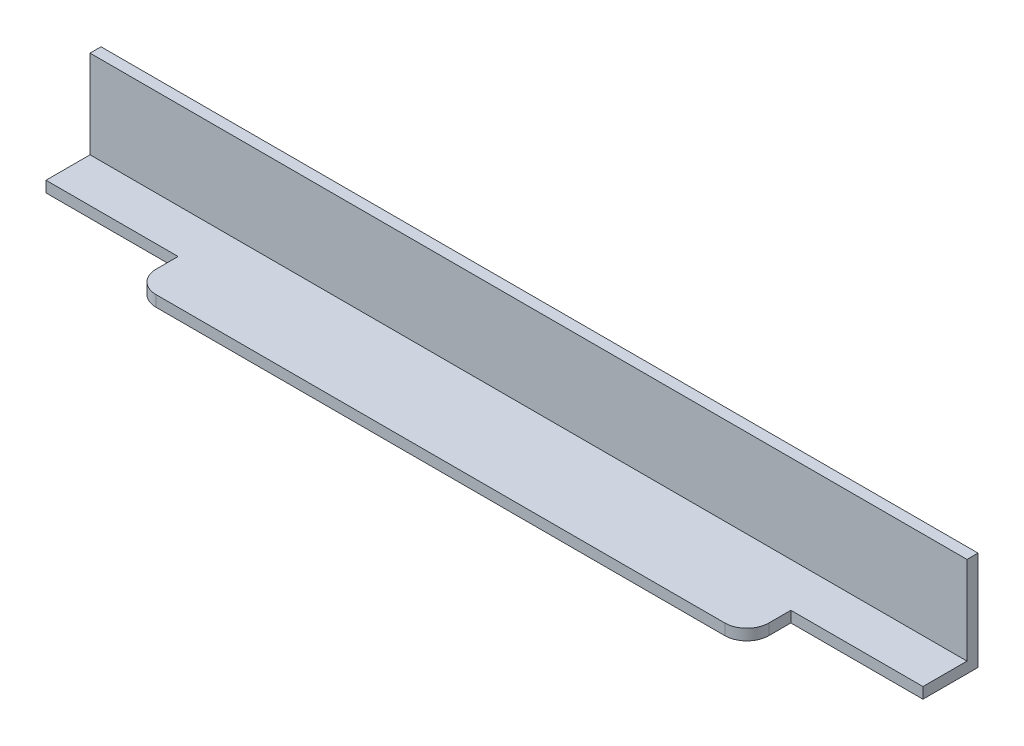
ISO-10303-21;
HEADER;
FILE_DESCRIPTION(('STEP AP214'),'2;1');
FILE_NAME('part.step','',(''),(''),'','','');
FILE_SCHEMA(('AUTOMOTIVE_DESIGN { 1 0 10303 214 1 1 1 1 }'));
ENDSEC;
DATA;
#1=APPLICATION_CONTEXT('core data for automotive mechanical design processes');
#2=APPLICATION_PROTOCOL_DEFINITION('international standard','automotive_design',2000,#1);
#3=PRODUCT_CONTEXT('',#1,'mechanical');
#4=PRODUCT('Part','Part','',(#3));
#5=PRODUCT_RELATED_PRODUCT_CATEGORY('part','',(#4));
#6=PRODUCT_DEFINITION_FORMATION('','',#4);
#7=PRODUCT_DEFINITION_CONTEXT('part definition',#1,'design');
#8=PRODUCT_DEFINITION('design','',#6,#7);
#9=PRODUCT_DEFINITION_SHAPE('','',#8);
#10=(LENGTH_UNIT() NAMED_UNIT(*) SI_UNIT(.MILLI.,.METRE.));
#11=(NAMED_UNIT(*) PLANE_ANGLE_UNIT() SI_UNIT($,.RADIAN.));
#12=(NAMED_UNIT(*) SI_UNIT($,.STERADIAN.) SOLID_ANGLE_UNIT());
#13=UNCERTAINTY_MEASURE_WITH_UNIT(LENGTH_MEASURE(1.E-05),#10,'distance_accuracy_value','');
#14=(GEOMETRIC_REPRESENTATION_CONTEXT(3) GLOBAL_UNCERTAINTY_ASSIGNED_CONTEXT((#13)) GLOBAL_UNIT_ASSIGNED_CONTEXT((#10,
#11,#12)) REPRESENTATION_CONTEXT('',''));
#15=CARTESIAN_POINT('',(0.,0.,0.));
#16=DIRECTION('',(0.,0.,1.));
#17=DIRECTION('',(1.,0.,0.));
#18=AXIS2_PLACEMENT_3D('',#15,#16,#17);
#19=CARTESIAN_POINT('',(0.,0.,15.));
#20=DIRECTION('',(0.,0.,-1.));
#21=DIRECTION('',(-1.,0.,0.));
#22=AXIS2_PLACEMENT_3D('',#19,#20,#21);
#23=PLANE('',#22);
#24=DIRECTION('',(0.,1.,0.));
#25=VECTOR('',#24,1.);
#26=CARTESIAN_POINT('',(-36.,-27.,15.));
#27=LINE('',#26,#25);
#28=CARTESIAN_POINT('',(-36.,-27.,15.));
#29=VERTEX_POINT('',#28);
#30=CARTESIAN_POINT('',(-36.,-24.,15.));
#31=VERTEX_POINT('',#30);
#32=EDGE_CURVE('E170',#29,#31,#27,.T.);
#33=ORIENTED_EDGE('',*,*,#32,.F.);
#34=DIRECTION('',(1.,0.,0.));
#35=VECTOR('',#34,1.);
#36=CARTESIAN_POINT('',(-239.,-27.,15.));
#37=LINE('',#36,#35);
#38=CARTESIAN_POINT('',(0.,-27.,15.));
#39=VERTEX_POINT('',#38);
#40=EDGE_CURVE('E180',#29,#39,#37,.T.);
#41=ORIENTED_EDGE('',*,*,#40,.T.);
#42=DIRECTION('',(0.,1.,0.));
#43=VECTOR('',#42,1.);
#44=CARTESIAN_POINT('',(0.,-27.,15.));
#45=LINE('',#44,#43);
#46=CARTESIAN_POINT('',(0.,-24.,15.));
#47=VERTEX_POINT('',#46);
#48=EDGE_CURVE('E183',#39,#47,#45,.T.);
#49=ORIENTED_EDGE('',*,*,#48,.T.);
#50=DIRECTION('',(-1.,0.,0.));
#51=VECTOR('',#50,1.);
#52=CARTESIAN_POINT('',(-239.,-24.,15.));
#53=LINE('',#52,#51);
#54=EDGE_CURVE('E186',#47,#31,#53,.T.);
#55=ORIENTED_EDGE('',*,*,#54,.T.);
#56=EDGE_LOOP('',(#33,#41,#49,#55));
#57=FACE_BOUND('',#56,.T.);
#58=ADVANCED_FACE('F39',(#57),#23,.F.);
#59=CARTESIAN_POINT('',(0.,0.,3.));
#60=DIRECTION('',(0.,0.,-1.));
#61=DIRECTION('',(-1.,0.,0.));
#62=AXIS2_PLACEMENT_3D('',#59,#60,#61);
#63=PLANE('',#62);
#64=DIRECTION('',(-1.,0.,0.));
#65=VECTOR('',#64,1.);
#66=CARTESIAN_POINT('',(-239.,-24.,3.));
#67=LINE('',#66,#65);
#68=CARTESIAN_POINT('',(0.,-24.,3.));
#69=VERTEX_POINT('',#68);
#70=CARTESIAN_POINT('',(-239.,-24.,3.));
#71=VERTEX_POINT('',#70);
#72=EDGE_CURVE('E62',#69,#71,#67,.T.);
#73=ORIENTED_EDGE('',*,*,#72,.F.);
#74=DIRECTION('',(0.,1.,0.));
#75=VECTOR('',#74,1.);
#76=CARTESIAN_POINT('',(0.,0.,3.));
#77=LINE('',#76,#75);
#78=CARTESIAN_POINT('',(0.,0.,3.));
#79=VERTEX_POINT('',#78);
#80=EDGE_CURVE('E197',#69,#79,#77,.T.);
#81=ORIENTED_EDGE('',*,*,#80,.T.);
#82=DIRECTION('',(-1.,0.,0.));
#83=VECTOR('',#82,1.);
#84=CARTESIAN_POINT('',(0.,0.,3.));
#85=LINE('',#84,#83);
#86=CARTESIAN_POINT('',(-239.,0.,3.));
#87=VERTEX_POINT('',#86);
#88=EDGE_CURVE('E199',#79,#87,#85,.T.);
#89=ORIENTED_EDGE('',*,*,#88,.T.);
#90=DIRECTION('',(0.,-1.,0.));
#91=VECTOR('',#90,1.);
#92=CARTESIAN_POINT('',(-239.,0.,3.));
#93=LINE('',#92,#91);
#94=EDGE_CURVE('E202',#87,#71,#93,.T.);
#95=ORIENTED_EDGE('',*,*,#94,.T.);
#96=EDGE_LOOP('',(#73,#81,#89,#95));
#97=FACE_BOUND('',#96,.T.);
#98=ADVANCED_FACE('F263',(#97),#63,.F.);
#99=CARTESIAN_POINT('',(0.,0.,3.));
#100=DIRECTION('',(-1.,0.,0.));
#101=DIRECTION('',(0.,-1.,0.));
#102=AXIS2_PLACEMENT_3D('',#99,#100,#101);
#103=PLANE('',#102);
#104=DIRECTION('',(0.,1.,0.));
#105=VECTOR('',#104,1.);
#106=CARTESIAN_POINT('',(0.,0.,0.));
#107=LINE('',#106,#105);
#108=CARTESIAN_POINT('',(0.,-27.,0.));
#109=VERTEX_POINT('',#108);
#110=CARTESIAN_POINT('',(0.,0.,0.));
#111=VERTEX_POINT('',#110);
#112=EDGE_CURVE('E196',#109,#111,#107,.T.);
#113=ORIENTED_EDGE('',*,*,#112,.T.);
#114=DIRECTION('',(0.,0.,-1.));
#115=VECTOR('',#114,1.);
#116=CARTESIAN_POINT('',(0.,0.,3.));
#117=LINE('',#116,#115);
#118=EDGE_CURVE('E11',#79,#111,#117,.T.);
#119=ORIENTED_EDGE('',*,*,#118,.F.);
#120=ORIENTED_EDGE('',*,*,#80,.F.);
#121=DIRECTION('',(0.,0.,-1.));
#122=VECTOR('',#121,1.);
#123=CARTESIAN_POINT('',(0.,-24.,15.));
#124=LINE('',#123,#122);
#125=EDGE_CURVE('E193',#47,#69,#124,.T.);
#126=ORIENTED_EDGE('',*,*,#125,.F.);
#127=ORIENTED_EDGE('',*,*,#48,.F.);
#128=DIRECTION('',(0.,0.,-1.));
#129=VECTOR('',#128,1.);
#130=CARTESIAN_POINT('',(0.,-27.,3.));
#131=LINE('',#130,#129);
#132=EDGE_CURVE('E204',#39,#109,#131,.T.);
#133=ORIENTED_EDGE('',*,*,#132,.T.);
#134=EDGE_LOOP('',(#113,#119,#120,#126,#127,#133));
#135=FACE_BOUND('',#134,.T.);
#136=ADVANCED_FACE('F41',(#135),#103,.F.);
#137=CARTESIAN_POINT('',(0.,0.,3.));
#138=DIRECTION('',(0.,-1.,0.));
#139=DIRECTION('',(0.,0.,-1.));
#140=AXIS2_PLACEMENT_3D('',#137,#138,#139);
#141=PLANE('',#140);
#142=DIRECTION('',(-1.,0.,0.));
#143=VECTOR('',#142,1.);
#144=CARTESIAN_POINT('',(0.,0.,0.));
#145=LINE('',#144,#143);
#146=CARTESIAN_POINT('',(-239.,0.,0.));
#147=VERTEX_POINT('',#146);
#148=EDGE_CURVE('E207',#111,#147,#145,.T.);
#149=ORIENTED_EDGE('',*,*,#148,.T.);
#150=DIRECTION('',(0.,0.,-1.));
#151=VECTOR('',#150,1.);
#152=CARTESIAN_POINT('',(-239.,0.,3.));
#153=LINE('',#152,#151);
#154=EDGE_CURVE('E47',#87,#147,#153,.T.);
#155=ORIENTED_EDGE('',*,*,#154,.F.);
#156=ORIENTED_EDGE('',*,*,#88,.F.);
#157=ORIENTED_EDGE('',*,*,#118,.T.);
#158=EDGE_LOOP('',(#149,#155,#156,#157));
#159=FACE_BOUND('',#158,.T.);
#160=ADVANCED_FACE('F271',(#159),#141,.F.);
#161=CARTESIAN_POINT('',(-239.,0.,3.));
#162=DIRECTION('',(1.,0.,0.));
#163=DIRECTION('',(0.,0.,-1.));
#164=AXIS2_PLACEMENT_3D('',#161,#162,#163);
#165=PLANE('',#164);
#166=DIRECTION('',(0.,-1.,0.));
#167=VECTOR('',#166,1.);
#168=CARTESIAN_POINT('',(-239.,0.,0.));
#169=LINE('',#168,#167);
#170=CARTESIAN_POINT('',(-239.,-27.,0.));
#171=VERTEX_POINT('',#170);
#172=EDGE_CURVE('E209',#147,#171,#169,.T.);
#173=ORIENTED_EDGE('',*,*,#172,.T.);
#174=DIRECTION('',(0.,0.,-1.));
#175=VECTOR('',#174,1.);
#176=CARTESIAN_POINT('',(-239.,-27.,3.));
#177=LINE('',#176,#175);
#178=CARTESIAN_POINT('',(-239.,-27.,15.));
#179=VERTEX_POINT('',#178);
#180=EDGE_CURVE('E214',#179,#171,#177,.T.);
#181=ORIENTED_EDGE('',*,*,#180,.F.);
#182=DIRECTION('',(0.,-1.,0.));
#183=VECTOR('',#182,1.);
#184=CARTESIAN_POINT('',(-239.,-27.,15.));
#185=LINE('',#184,#183);
#186=CARTESIAN_POINT('',(-239.,-24.,15.));
#187=VERTEX_POINT('',#186);
#188=EDGE_CURVE('E177',#187,#179,#185,.T.);
#189=ORIENTED_EDGE('',*,*,#188,.F.);
#190=DIRECTION('',(0.,0.,-1.));
#191=VECTOR('',#190,1.);
#192=CARTESIAN_POINT('',(-239.,-24.,15.));
#193=LINE('',#192,#191);
#194=EDGE_CURVE('E189',#187,#71,#193,.T.);
#195=ORIENTED_EDGE('',*,*,#194,.T.);
#196=ORIENTED_EDGE('',*,*,#94,.F.);
#197=ORIENTED_EDGE('',*,*,#154,.T.);
#198=EDGE_LOOP('',(#173,#181,#189,#195,#196,#197));
#199=FACE_BOUND('',#198,.T.);
#200=ADVANCED_FACE('F221',(#199),#165,.F.);
#201=CARTESIAN_POINT('',(0.,-27.,3.));
#202=DIRECTION('',(0.,1.,0.));
#203=DIRECTION('',(-1.,0.,0.));
#204=AXIS2_PLACEMENT_3D('',#201,#202,#203);
#205=PLANE('',#204);
#206=DIRECTION('',(1.,0.,0.));
#207=VECTOR('',#206,1.);
#208=CARTESIAN_POINT('',(0.,-27.,0.));
#209=LINE('',#208,#207);
#210=EDGE_CURVE('E200',#171,#109,#209,.T.);
#211=ORIENTED_EDGE('',*,*,#210,.T.);
#212=ORIENTED_EDGE('',*,*,#132,.F.);
#213=ORIENTED_EDGE('',*,*,#40,.F.);
#214=DIRECTION('',(0.,0.,-1.));
#215=VECTOR('',#214,1.);
#216=CARTESIAN_POINT('',(-36.,-27.,15.));
#217=LINE('',#216,#215);
#218=CARTESIAN_POINT('',(-36.,-27.,21.));
#219=VERTEX_POINT('',#218);
#220=EDGE_CURVE('E136',#219,#29,#217,.T.);
#221=ORIENTED_EDGE('',*,*,#220,.F.);
#222=CARTESIAN_POINT('',(-42.,-27.,21.));
#223=DIRECTION('',(0.,1.,0.));
#224=DIRECTION('',(0.,0.,1.));
#225=AXIS2_PLACEMENT_3D('',#222,#223,#224);
#226=CIRCLE('',#225,6.);
#227=CARTESIAN_POINT('',(-42.,-27.,27.));
#228=VERTEX_POINT('',#227);
#229=EDGE_CURVE('E158',#228,#219,#226,.T.);
#230=ORIENTED_EDGE('',*,*,#229,.F.);
#231=DIRECTION('',(1.,0.,0.));
#232=VECTOR('',#231,1.);
#233=CARTESIAN_POINT('',(-197.,-27.,27.));
#234=LINE('',#233,#232);
#235=CARTESIAN_POINT('',(-197.,-27.,27.));
#236=VERTEX_POINT('',#235);
#237=EDGE_CURVE('E147',#236,#228,#234,.T.);
#238=ORIENTED_EDGE('',*,*,#237,.F.);
#239=CARTESIAN_POINT('',(-197.,-27.,21.));
#240=DIRECTION('',(0.,1.,0.));
#241=DIRECTION('',(0.,0.,1.));
#242=AXIS2_PLACEMENT_3D('',#239,#240,#241);
#243=CIRCLE('',#242,6.);
#244=CARTESIAN_POINT('',(-203.,-27.,21.));
#245=VERTEX_POINT('',#244);
#246=EDGE_CURVE('E131',#245,#236,#243,.T.);
#247=ORIENTED_EDGE('',*,*,#246,.F.);
#248=DIRECTION('',(0.,0.,1.));
#249=VECTOR('',#248,1.);
#250=CARTESIAN_POINT('',(-203.,-27.,15.));
#251=LINE('',#250,#249);
#252=CARTESIAN_POINT('',(-203.,-27.,15.));
#253=VERTEX_POINT('',#252);
#254=EDGE_CURVE('E143',#253,#245,#251,.T.);
#255=ORIENTED_EDGE('',*,*,#254,.F.);
#256=EDGE_CURVE('E181',#179,#253,#37,.T.);
#257=ORIENTED_EDGE('',*,*,#256,.F.);
#258=ORIENTED_EDGE('',*,*,#180,.T.);
#259=EDGE_LOOP('',(#211,#212,#213,#221,#230,#238,#247,#255,#257,#258));
#260=FACE_BOUND('',#259,.T.);
#261=ADVANCED_FACE('F141',(#260),#205,.F.);
#262=CARTESIAN_POINT('',(0.,0.,0.));
#263=DIRECTION('',(0.,0.,-1.));
#264=DIRECTION('',(-1.,0.,0.));
#265=AXIS2_PLACEMENT_3D('',#262,#263,#264);
#266=PLANE('',#265);
#267=ORIENTED_EDGE('',*,*,#112,.F.);
#268=ORIENTED_EDGE('',*,*,#210,.F.);
#269=ORIENTED_EDGE('',*,*,#172,.F.);
#270=ORIENTED_EDGE('',*,*,#148,.F.);
#271=EDGE_LOOP('',(#267,#268,#269,#270));
#272=FACE_BOUND('',#271,.T.);
#273=ADVANCED_FACE('F227',(#272),#266,.T.);
#274=CARTESIAN_POINT('',(-239.,-24.,15.));
#275=DIRECTION('',(0.,-1.,0.));
#276=DIRECTION('',(0.,0.,-1.));
#277=AXIS2_PLACEMENT_3D('',#274,#275,#276);
#278=PLANE('',#277);
#279=ORIENTED_EDGE('',*,*,#72,.T.);
#280=ORIENTED_EDGE('',*,*,#194,.F.);
#281=CARTESIAN_POINT('',(-203.,-24.,15.));
#282=VERTEX_POINT('',#281);
#283=EDGE_CURVE('E185',#282,#187,#53,.T.);
#284=ORIENTED_EDGE('',*,*,#283,.F.);
#285=DIRECTION('',(0.,0.,1.));
#286=VECTOR('',#285,1.);
#287=CARTESIAN_POINT('',(-203.,-24.,15.));
#288=LINE('',#287,#286);
#289=CARTESIAN_POINT('',(-203.,-24.,21.));
#290=VERTEX_POINT('',#289);
#291=EDGE_CURVE('E54',#282,#290,#288,.T.);
#292=ORIENTED_EDGE('',*,*,#291,.T.);
#293=CARTESIAN_POINT('',(-197.,-24.,21.));
#294=DIRECTION('',(0.,1.,0.));
#295=DIRECTION('',(0.,0.,1.));
#296=AXIS2_PLACEMENT_3D('',#293,#294,#295);
#297=CIRCLE('',#296,6.);
#298=CARTESIAN_POINT('',(-197.,-24.,27.));
#299=VERTEX_POINT('',#298);
#300=EDGE_CURVE('E133',#290,#299,#297,.T.);
#301=ORIENTED_EDGE('',*,*,#300,.T.);
#302=DIRECTION('',(1.,0.,0.));
#303=VECTOR('',#302,1.);
#304=CARTESIAN_POINT('',(-197.,-24.,27.));
#305=LINE('',#304,#303);
#306=CARTESIAN_POINT('',(-42.,-24.,27.));
#307=VERTEX_POINT('',#306);
#308=EDGE_CURVE('E164',#299,#307,#305,.T.);
#309=ORIENTED_EDGE('',*,*,#308,.T.);
#310=CARTESIAN_POINT('',(-42.,-24.,21.));
#311=DIRECTION('',(0.,1.,0.));
#312=DIRECTION('',(0.,0.,1.));
#313=AXIS2_PLACEMENT_3D('',#310,#311,#312);
#314=CIRCLE('',#313,6.);
#315=CARTESIAN_POINT('',(-36.,-24.,21.));
#316=VERTEX_POINT('',#315);
#317=EDGE_CURVE('E154',#307,#316,#314,.T.);
#318=ORIENTED_EDGE('',*,*,#317,.T.);
#319=DIRECTION('',(0.,0.,-1.));
#320=VECTOR('',#319,1.);
#321=CARTESIAN_POINT('',(-36.,-24.,15.));
#322=LINE('',#321,#320);
#323=EDGE_CURVE('E151',#316,#31,#322,.T.);
#324=ORIENTED_EDGE('',*,*,#323,.T.);
#325=ORIENTED_EDGE('',*,*,#54,.F.);
#326=ORIENTED_EDGE('',*,*,#125,.T.);
#327=EDGE_LOOP('',(#279,#280,#284,#292,#301,#309,#318,#324,#325,#326));
#328=FACE_BOUND('',#327,.T.);
#329=ADVANCED_FACE('F247',(#328),#278,.F.);
#330=ORIENTED_EDGE('',*,*,#256,.T.);
#331=DIRECTION('',(0.,1.,0.));
#332=VECTOR('',#331,1.);
#333=CARTESIAN_POINT('',(-203.,-27.,15.));
#334=LINE('',#333,#332);
#335=EDGE_CURVE('E150',#253,#282,#334,.T.);
#336=ORIENTED_EDGE('',*,*,#335,.T.);
#337=ORIENTED_EDGE('',*,*,#283,.T.);
#338=ORIENTED_EDGE('',*,*,#188,.T.);
#339=EDGE_LOOP('',(#330,#336,#337,#338));
#340=FACE_BOUND('',#339,.T.);
#341=ADVANCED_FACE('F252',(#340),#23,.F.);
#342=CARTESIAN_POINT('',(-203.,-27.,15.));
#343=DIRECTION('',(-1.,0.,0.));
#344=DIRECTION('',(0.,0.,1.));
#345=AXIS2_PLACEMENT_3D('',#342,#343,#344);
#346=PLANE('',#345);
#347=ORIENTED_EDGE('',*,*,#291,.F.);
#348=ORIENTED_EDGE('',*,*,#335,.F.);
#349=ORIENTED_EDGE('',*,*,#254,.T.);
#350=DIRECTION('',(0.,1.,0.));
#351=VECTOR('',#350,1.);
#352=CARTESIAN_POINT('',(-203.,-27.,21.));
#353=LINE('',#352,#351);
#354=EDGE_CURVE('E128',#245,#290,#353,.T.);
#355=ORIENTED_EDGE('',*,*,#354,.T.);
#356=EDGE_LOOP('',(#347,#348,#349,#355));
#357=FACE_BOUND('',#356,.T.);
#358=ADVANCED_FACE('F149',(#357),#346,.T.);
#359=CARTESIAN_POINT('',(-36.,-27.,15.));
#360=DIRECTION('',(1.,0.,0.));
#361=DIRECTION('',(0.,0.,-1.));
#362=AXIS2_PLACEMENT_3D('',#359,#360,#361);
#363=PLANE('',#362);
#364=ORIENTED_EDGE('',*,*,#323,.F.);
#365=DIRECTION('',(0.,1.,0.));
#366=VECTOR('',#365,1.);
#367=CARTESIAN_POINT('',(-36.,-27.,21.));
#368=LINE('',#367,#366);
#369=EDGE_CURVE('E172',#219,#316,#368,.T.);
#370=ORIENTED_EDGE('',*,*,#369,.F.);
#371=ORIENTED_EDGE('',*,*,#220,.T.);
#372=ORIENTED_EDGE('',*,*,#32,.T.);
#373=EDGE_LOOP('',(#364,#370,#371,#372));
#374=FACE_BOUND('',#373,.T.);
#375=ADVANCED_FACE('F259',(#374),#363,.T.);
#376=CARTESIAN_POINT('',(-42.,-27.,21.));
#377=DIRECTION('',(0.,1.,0.));
#378=DIRECTION('',(0.,0.,1.));
#379=AXIS2_PLACEMENT_3D('',#376,#377,#378);
#380=CYLINDRICAL_SURFACE('',#379,6.);
#381=ORIENTED_EDGE('',*,*,#317,.F.);
#382=DIRECTION('',(0.,1.,0.));
#383=VECTOR('',#382,1.);
#384=CARTESIAN_POINT('',(-42.,-27.,27.));
#385=LINE('',#384,#383);
#386=EDGE_CURVE('E174',#228,#307,#385,.T.);
#387=ORIENTED_EDGE('',*,*,#386,.F.);
#388=ORIENTED_EDGE('',*,*,#229,.T.);
#389=ORIENTED_EDGE('',*,*,#369,.T.);
#390=EDGE_LOOP('',(#381,#387,#388,#389));
#391=FACE_BOUND('',#390,.T.);
#392=ADVANCED_FACE('F241',(#391),#380,.T.);
#393=CARTESIAN_POINT('',(-197.,-27.,27.));
#394=DIRECTION('',(0.,0.,1.));
#395=DIRECTION('',(1.,0.,0.));
#396=AXIS2_PLACEMENT_3D('',#393,#394,#395);
#397=PLANE('',#396);
#398=ORIENTED_EDGE('',*,*,#308,.F.);
#399=DIRECTION('',(0.,1.,0.));
#400=VECTOR('',#399,1.);
#401=CARTESIAN_POINT('',(-197.,-27.,27.));
#402=LINE('',#401,#400);
#403=EDGE_CURVE('E135',#236,#299,#402,.T.);
#404=ORIENTED_EDGE('',*,*,#403,.F.);
#405=ORIENTED_EDGE('',*,*,#237,.T.);
#406=ORIENTED_EDGE('',*,*,#386,.T.);
#407=EDGE_LOOP('',(#398,#404,#405,#406));
#408=FACE_BOUND('',#407,.T.);
#409=ADVANCED_FACE('F245',(#408),#397,.T.);
#410=CARTESIAN_POINT('',(-197.,-27.,21.));
#411=DIRECTION('',(0.,1.,0.));
#412=DIRECTION('',(0.,0.,1.));
#413=AXIS2_PLACEMENT_3D('',#410,#411,#412);
#414=CYLINDRICAL_SURFACE('',#413,6.);
#415=ORIENTED_EDGE('',*,*,#300,.F.);
#416=ORIENTED_EDGE('',*,*,#354,.F.);
#417=ORIENTED_EDGE('',*,*,#246,.T.);
#418=ORIENTED_EDGE('',*,*,#403,.T.);
#419=EDGE_LOOP('',(#415,#416,#417,#418));
#420=FACE_BOUND('',#419,.T.);
#421=ADVANCED_FACE('F130',(#420),#414,.T.);
#422=CLOSED_SHELL('',(#58,#98,#136,#160,#200,#261,#273,#329,#341,#358,#375,#392,#409,#421));
#423=MANIFOLD_SOLID_BREP('B2',#422);
#424=ADVANCED_BREP_SHAPE_REPRESENTATION('',(#18,#423),#14);
#425=SHAPE_DEFINITION_REPRESENTATION(#9,#424);
ENDSEC;
END-ISO-10303-21;
